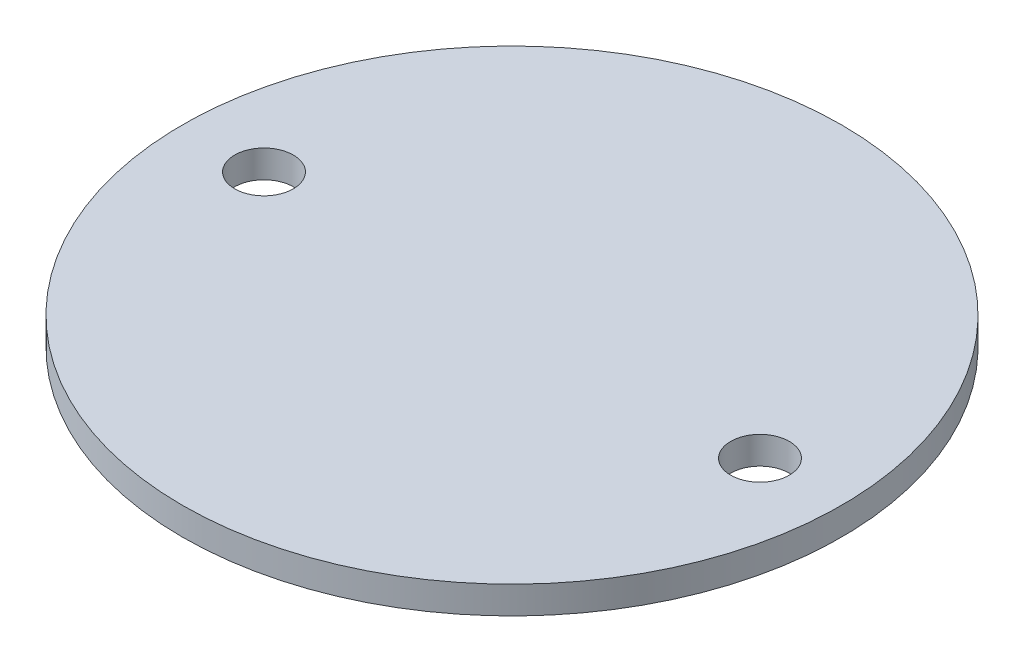
ISO-10303-21;
HEADER;
FILE_DESCRIPTION(('STEP AP214'),'2;1');
FILE_NAME('part.step','',(''),(''),'','','');
FILE_SCHEMA(('AUTOMOTIVE_DESIGN { 1 0 10303 214 1 1 1 1 }'));
ENDSEC;
DATA;
#1=APPLICATION_CONTEXT('core data for automotive mechanical design processes');
#2=APPLICATION_PROTOCOL_DEFINITION('international standard','automotive_design',2000,#1);
#3=PRODUCT_CONTEXT('',#1,'mechanical');
#4=PRODUCT('Part','Part','',(#3));
#5=PRODUCT_RELATED_PRODUCT_CATEGORY('part','',(#4));
#6=PRODUCT_DEFINITION_FORMATION('','',#4);
#7=PRODUCT_DEFINITION_CONTEXT('part definition',#1,'design');
#8=PRODUCT_DEFINITION('design','',#6,#7);
#9=PRODUCT_DEFINITION_SHAPE('','',#8);
#10=(LENGTH_UNIT() NAMED_UNIT(*) SI_UNIT(.MILLI.,.METRE.));
#11=(NAMED_UNIT(*) PLANE_ANGLE_UNIT() SI_UNIT($,.RADIAN.));
#12=(NAMED_UNIT(*) SI_UNIT($,.STERADIAN.) SOLID_ANGLE_UNIT());
#13=UNCERTAINTY_MEASURE_WITH_UNIT(LENGTH_MEASURE(1.E-05),#10,'distance_accuracy_value','');
#14=(GEOMETRIC_REPRESENTATION_CONTEXT(3) GLOBAL_UNCERTAINTY_ASSIGNED_CONTEXT((#13)) GLOBAL_UNIT_ASSIGNED_CONTEXT((#10,
#11,#12)) REPRESENTATION_CONTEXT('',''));
#15=CARTESIAN_POINT('',(0.,0.,0.));
#16=DIRECTION('',(0.,0.,1.));
#17=DIRECTION('',(1.,0.,0.));
#18=AXIS2_PLACEMENT_3D('',#15,#16,#17);
#19=CARTESIAN_POINT('',(0.,1.5875,0.));
#20=DIRECTION('',(0.,-1.,0.));
#21=DIRECTION('',(0.,0.,-1.));
#22=AXIS2_PLACEMENT_3D('',#19,#20,#21);
#23=CYLINDRICAL_SURFACE('',#22,37.973);
#24=CARTESIAN_POINT('',(0.,1.5875,0.));
#25=DIRECTION('',(0.,1.,0.));
#26=DIRECTION('',(0.,0.,1.));
#27=AXIS2_PLACEMENT_3D('',#24,#25,#26);
#28=CIRCLE('',#27,37.973);
#29=CARTESIAN_POINT('',(0.,1.5875,37.973));
#30=VERTEX_POINT('',#29);
#31=EDGE_CURVE('E10',#30,#30,#28,.T.);
#32=ORIENTED_EDGE('',*,*,#31,.F.);
#33=EDGE_LOOP('',(#32));
#34=FACE_BOUND('',#33,.T.);
#35=CARTESIAN_POINT('',(0.,-1.5875,0.));
#36=DIRECTION('',(0.,1.,0.));
#37=DIRECTION('',(0.,0.,1.));
#38=AXIS2_PLACEMENT_3D('',#35,#36,#37);
#39=CIRCLE('',#38,37.973);
#40=CARTESIAN_POINT('',(0.,-1.5875,37.973));
#41=VERTEX_POINT('',#40);
#42=EDGE_CURVE('E42',#41,#41,#39,.T.);
#43=ORIENTED_EDGE('',*,*,#42,.T.);
#44=EDGE_LOOP('',(#43));
#45=FACE_BOUND('',#44,.T.);
#46=ADVANCED_FACE('F39',(#34,#45),#23,.T.);
#47=CARTESIAN_POINT('',(0.,1.5875,0.));
#48=DIRECTION('',(0.,1.,0.));
#49=DIRECTION('',(0.,0.,1.));
#50=AXIS2_PLACEMENT_3D('',#47,#48,#49);
#51=PLANE('',#50);
#52=CARTESIAN_POINT('',(-28.575,1.5875,0.));
#53=DIRECTION('',(0.,1.,0.));
#54=DIRECTION('',(0.,0.,1.));
#55=AXIS2_PLACEMENT_3D('',#52,#53,#54);
#56=CIRCLE('',#55,3.37819999999999);
#57=CARTESIAN_POINT('',(-28.575,1.5875,3.37819999999999));
#58=VERTEX_POINT('',#57);
#59=EDGE_CURVE('E64',#58,#58,#56,.T.);
#60=ORIENTED_EDGE('',*,*,#59,.F.);
#61=EDGE_LOOP('',(#60));
#62=FACE_BOUND('',#61,.T.);
#63=CARTESIAN_POINT('',(28.575,1.5875,0.));
#64=DIRECTION('',(0.,1.,0.));
#65=DIRECTION('',(0.,0.,1.));
#66=AXIS2_PLACEMENT_3D('',#63,#64,#65);
#67=CIRCLE('',#66,3.37819999999999);
#68=CARTESIAN_POINT('',(28.575,1.5875,3.37819999999998));
#69=VERTEX_POINT('',#68);
#70=EDGE_CURVE('E56',#69,#69,#67,.T.);
#71=ORIENTED_EDGE('',*,*,#70,.F.);
#72=EDGE_LOOP('',(#71));
#73=FACE_BOUND('',#72,.T.);
#74=ORIENTED_EDGE('',*,*,#31,.T.);
#75=EDGE_LOOP('',(#74));
#76=FACE_BOUND('',#75,.T.);
#77=ADVANCED_FACE('F71',(#62,#73,#76),#51,.T.);
#78=CARTESIAN_POINT('',(0.,-1.5875,0.));
#79=DIRECTION('',(0.,1.,0.));
#80=DIRECTION('',(0.,0.,1.));
#81=AXIS2_PLACEMENT_3D('',#78,#79,#80);
#82=PLANE('',#81);
#83=CARTESIAN_POINT('',(-28.575,-1.5875,0.));
#84=DIRECTION('',(0.,1.,0.));
#85=DIRECTION('',(0.,0.,1.));
#86=AXIS2_PLACEMENT_3D('',#83,#84,#85);
#87=CIRCLE('',#86,3.3782);
#88=CARTESIAN_POINT('',(-28.575,-1.5875,3.3782));
#89=VERTEX_POINT('',#88);
#90=EDGE_CURVE('E60',#89,#89,#87,.T.);
#91=ORIENTED_EDGE('',*,*,#90,.T.);
#92=EDGE_LOOP('',(#91));
#93=FACE_BOUND('',#92,.T.);
#94=CARTESIAN_POINT('',(28.575,-1.5875,0.));
#95=DIRECTION('',(0.,1.,0.));
#96=DIRECTION('',(0.,0.,1.));
#97=AXIS2_PLACEMENT_3D('',#94,#95,#96);
#98=CIRCLE('',#97,3.3782);
#99=CARTESIAN_POINT('',(28.575,-1.5875,3.37819999999999));
#100=VERTEX_POINT('',#99);
#101=EDGE_CURVE('E51',#100,#100,#98,.T.);
#102=ORIENTED_EDGE('',*,*,#101,.T.);
#103=EDGE_LOOP('',(#102));
#104=FACE_BOUND('',#103,.T.);
#105=ORIENTED_EDGE('',*,*,#42,.F.);
#106=EDGE_LOOP('',(#105));
#107=FACE_BOUND('',#106,.T.);
#108=ADVANCED_FACE('F74',(#93,#104,#107),#82,.F.);
#109=CARTESIAN_POINT('',(28.575,1.5875,0.));
#110=DIRECTION('',(0.,1.,0.));
#111=DIRECTION('',(0.,0.,1.));
#112=AXIS2_PLACEMENT_3D('',#109,#110,#111);
#113=CYLINDRICAL_SURFACE('',#112,3.37819999999999);
#114=ORIENTED_EDGE('',*,*,#101,.F.);
#115=EDGE_LOOP('',(#114));
#116=FACE_BOUND('',#115,.T.);
#117=ORIENTED_EDGE('',*,*,#70,.T.);
#118=EDGE_LOOP('',(#117));
#119=FACE_BOUND('',#118,.T.);
#120=ADVANCED_FACE('F78',(#116,#119),#113,.F.);
#121=CARTESIAN_POINT('',(-28.575,1.5875,0.));
#122=DIRECTION('',(0.,1.,0.));
#123=DIRECTION('',(0.,0.,1.));
#124=AXIS2_PLACEMENT_3D('',#121,#122,#123);
#125=CYLINDRICAL_SURFACE('',#124,3.37819999999999);
#126=ORIENTED_EDGE('',*,*,#90,.F.);
#127=EDGE_LOOP('',(#126));
#128=FACE_BOUND('',#127,.T.);
#129=ORIENTED_EDGE('',*,*,#59,.T.);
#130=EDGE_LOOP('',(#129));
#131=FACE_BOUND('',#130,.T.);
#132=ADVANCED_FACE('F69',(#128,#131),#125,.F.);
#133=CLOSED_SHELL('',(#46,#77,#108,#120,#132));
#134=MANIFOLD_SOLID_BREP('B2',#133);
#135=ADVANCED_BREP_SHAPE_REPRESENTATION('',(#18,#134),#14);
#136=SHAPE_DEFINITION_REPRESENTATION(#9,#135);
ENDSEC;
END-ISO-10303-21;
